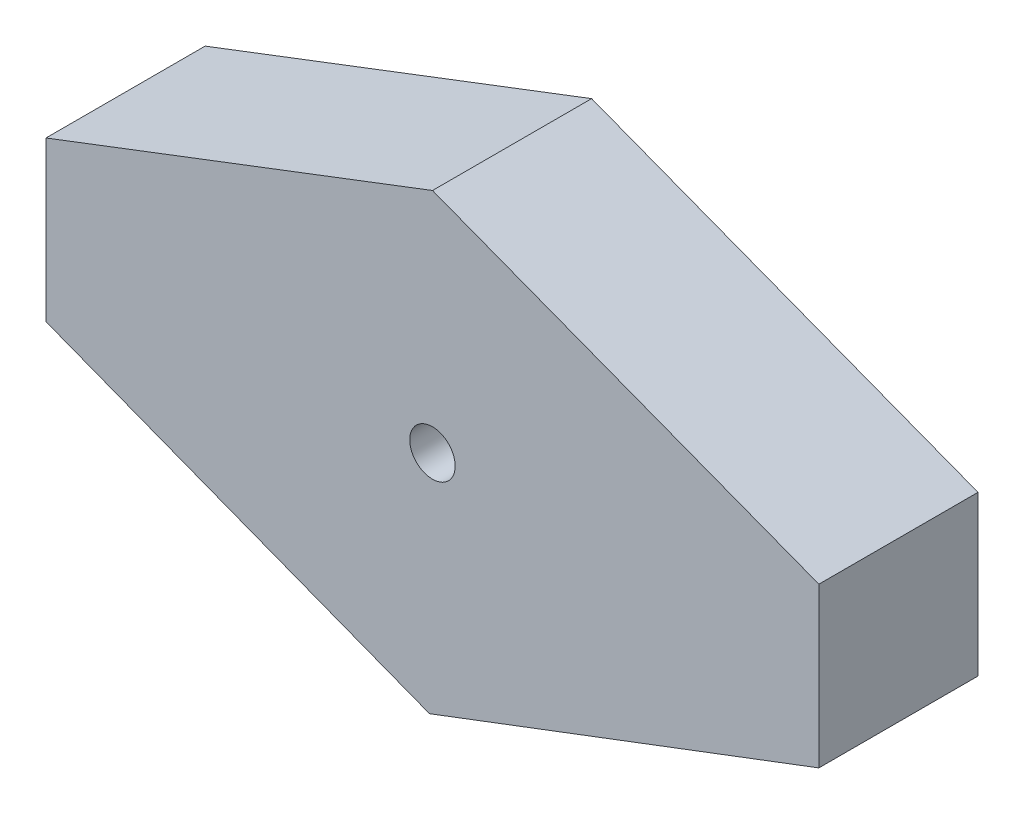
ISO-10303-21;
HEADER;
FILE_DESCRIPTION(('STEP AP214'),'2;1');
FILE_NAME('part.step','',(''),(''),'','','');
FILE_SCHEMA(('AUTOMOTIVE_DESIGN { 1 0 10303 214 1 1 1 1 }'));
ENDSEC;
DATA;
#1=APPLICATION_CONTEXT('core data for automotive mechanical design processes');
#2=APPLICATION_PROTOCOL_DEFINITION('international standard','automotive_design',2000,#1);
#3=PRODUCT_CONTEXT('',#1,'mechanical');
#4=PRODUCT('Part','Part','',(#3));
#5=PRODUCT_RELATED_PRODUCT_CATEGORY('part','',(#4));
#6=PRODUCT_DEFINITION_FORMATION('','',#4);
#7=PRODUCT_DEFINITION_CONTEXT('part definition',#1,'design');
#8=PRODUCT_DEFINITION('design','',#6,#7);
#9=PRODUCT_DEFINITION_SHAPE('','',#8);
#10=(LENGTH_UNIT() NAMED_UNIT(*) SI_UNIT(.MILLI.,.METRE.));
#11=(NAMED_UNIT(*) PLANE_ANGLE_UNIT() SI_UNIT($,.RADIAN.));
#12=(NAMED_UNIT(*) SI_UNIT($,.STERADIAN.) SOLID_ANGLE_UNIT());
#13=UNCERTAINTY_MEASURE_WITH_UNIT(LENGTH_MEASURE(1.E-05),#10,'distance_accuracy_value','');
#14=(GEOMETRIC_REPRESENTATION_CONTEXT(3) GLOBAL_UNCERTAINTY_ASSIGNED_CONTEXT((#13)) GLOBAL_UNIT_ASSIGNED_CONTEXT((#10,
#11,#12)) REPRESENTATION_CONTEXT('',''));
#15=CARTESIAN_POINT('',(0.,0.,0.));
#16=DIRECTION('',(0.,0.,1.));
#17=DIRECTION('',(1.,0.,0.));
#18=AXIS2_PLACEMENT_3D('',#15,#16,#17);
#19=CARTESIAN_POINT('',(-3.33523580590121,8.72407419084104,7.));
#20=DIRECTION('',(-0.357096400306171,0.934067535507136,0.));
#21=DIRECTION('',(-0.934067535507136,-0.357096400306171,0.));
#22=AXIS2_PLACEMENT_3D('',#19,#20,#21);
#23=PLANE('',#22);
#24=DIRECTION('',(0.934067535507136,0.357096400306171,0.));
#25=VECTOR('',#24,1.);
#26=CARTESIAN_POINT('',(-3.33523580590121,8.72407419084104,0.));
#27=LINE('',#26,#25);
#28=CARTESIAN_POINT('',(-17.,3.5,0.));
#29=VERTEX_POINT('',#28);
#30=CARTESIAN_POINT('',(0.00327850101035799,10.0003967221894,0.));
#31=VERTEX_POINT('',#30);
#32=EDGE_CURVE('E137',#29,#31,#27,.T.);
#33=ORIENTED_EDGE('',*,*,#32,.F.);
#34=DIRECTION('',(0.,0.,-1.));
#35=VECTOR('',#34,1.);
#36=CARTESIAN_POINT('',(-17.,3.5,7.));
#37=LINE('',#36,#35);
#38=CARTESIAN_POINT('',(-17.,3.5,7.));
#39=VERTEX_POINT('',#38);
#40=EDGE_CURVE('E11',#39,#29,#37,.T.);
#41=ORIENTED_EDGE('',*,*,#40,.F.);
#42=DIRECTION('',(0.934067535507136,0.357096400306171,0.));
#43=VECTOR('',#42,1.);
#44=CARTESIAN_POINT('',(-3.33523580590121,8.72407419084104,7.));
#45=LINE('',#44,#43);
#46=CARTESIAN_POINT('',(0.00327850101035799,10.0003967221894,7.));
#47=VERTEX_POINT('',#46);
#48=EDGE_CURVE('E160',#39,#47,#45,.T.);
#49=ORIENTED_EDGE('',*,*,#48,.T.);
#50=DIRECTION('',(0.,0.,-1.));
#51=VECTOR('',#50,1.);
#52=CARTESIAN_POINT('',(0.00327850101035799,10.0003967221894,7.));
#53=LINE('',#52,#51);
#54=EDGE_CURVE('E93',#47,#31,#53,.T.);
#55=ORIENTED_EDGE('',*,*,#54,.T.);
#56=EDGE_LOOP('',(#33,#41,#49,#55));
#57=FACE_BOUND('',#56,.T.);
#58=ADVANCED_FACE('F47',(#57),#23,.T.);
#59=CARTESIAN_POINT('',(-17.,0.,7.));
#60=DIRECTION('',(-1.,0.,0.));
#61=DIRECTION('',(0.,0.,1.));
#62=AXIS2_PLACEMENT_3D('',#59,#60,#61);
#63=PLANE('',#62);
#64=DIRECTION('',(0.,1.,0.));
#65=VECTOR('',#64,1.);
#66=CARTESIAN_POINT('',(-17.,0.,0.));
#67=LINE('',#66,#65);
#68=CARTESIAN_POINT('',(-17.,-3.5,0.));
#69=VERTEX_POINT('',#68);
#70=EDGE_CURVE('E141',#69,#29,#67,.T.);
#71=ORIENTED_EDGE('',*,*,#70,.F.);
#72=DIRECTION('',(0.,0.,-1.));
#73=VECTOR('',#72,1.);
#74=CARTESIAN_POINT('',(-17.,-3.5,7.));
#75=LINE('',#74,#73);
#76=CARTESIAN_POINT('',(-17.,-3.5,7.));
#77=VERTEX_POINT('',#76);
#78=EDGE_CURVE('E56',#77,#69,#75,.T.);
#79=ORIENTED_EDGE('',*,*,#78,.F.);
#80=DIRECTION('',(0.,1.,0.));
#81=VECTOR('',#80,1.);
#82=CARTESIAN_POINT('',(-17.,0.,7.));
#83=LINE('',#82,#81);
#84=EDGE_CURVE('E181',#77,#39,#83,.T.);
#85=ORIENTED_EDGE('',*,*,#84,.T.);
#86=ORIENTED_EDGE('',*,*,#40,.T.);
#87=EDGE_LOOP('',(#71,#79,#85,#86));
#88=FACE_BOUND('',#87,.T.);
#89=ADVANCED_FACE('F173',(#88),#63,.T.);
#90=CARTESIAN_POINT('',(-3.37094844904208,-8.75038071733361,7.));
#91=DIRECTION('',(-0.359482297756313,-0.933151904890003,0.));
#92=DIRECTION('',(0.933151904890003,-0.359482297756313,0.));
#93=AXIS2_PLACEMENT_3D('',#90,#91,#92);
#94=PLANE('',#93);
#95=DIRECTION('',(-0.933151904890003,0.359482297756313,0.));
#96=VECTOR('',#95,1.);
#97=CARTESIAN_POINT('',(-3.37094844904208,-8.75038071733361,0.));
#98=LINE('',#97,#96);
#99=CARTESIAN_POINT('',(-0.12933078779632,-9.9991636423917,0.));
#100=VERTEX_POINT('',#99);
#101=EDGE_CURVE('E145',#100,#69,#98,.T.);
#102=ORIENTED_EDGE('',*,*,#101,.F.);
#103=DIRECTION('',(0.,0.,-1.));
#104=VECTOR('',#103,1.);
#105=CARTESIAN_POINT('',(-0.12933078779632,-9.9991636423917,7.));
#106=LINE('',#105,#104);
#107=CARTESIAN_POINT('',(-0.12933078779632,-9.9991636423917,7.));
#108=VERTEX_POINT('',#107);
#109=EDGE_CURVE('E123',#108,#100,#106,.T.);
#110=ORIENTED_EDGE('',*,*,#109,.F.);
#111=DIRECTION('',(-0.933151904890003,0.359482297756313,0.));
#112=VECTOR('',#111,1.);
#113=CARTESIAN_POINT('',(-3.37094844904208,-8.75038071733361,7.));
#114=LINE('',#113,#112);
#115=EDGE_CURVE('E114',#108,#77,#114,.T.);
#116=ORIENTED_EDGE('',*,*,#115,.T.);
#117=ORIENTED_EDGE('',*,*,#78,.T.);
#118=EDGE_LOOP('',(#102,#110,#116,#117));
#119=FACE_BOUND('',#118,.T.);
#120=ADVANCED_FACE('F170',(#119),#94,.T.);
#121=CARTESIAN_POINT('',(3.30015514878063,-8.69795750730007,7.));
#122=DIRECTION('',(-0.3547416159971,0.934964376797194,0.));
#123=DIRECTION('',(-0.934964376797194,-0.3547416159971,0.));
#124=AXIS2_PLACEMENT_3D('',#121,#122,#123);
#125=PLANE('',#124);
#126=DIRECTION('',(0.934964376797194,0.3547416159971,0.));
#127=VECTOR('',#126,1.);
#128=CARTESIAN_POINT('',(3.30015514878063,-8.69795750730007,0.));
#129=LINE('',#128,#127);
#130=CARTESIAN_POINT('',(17.,-3.5,0.));
#131=VERTEX_POINT('',#130);
#132=EDGE_CURVE('E121',#100,#131,#129,.T.);
#133=ORIENTED_EDGE('',*,*,#132,.T.);
#134=DIRECTION('',(0.,0.,-1.));
#135=VECTOR('',#134,1.);
#136=CARTESIAN_POINT('',(17.,-3.5,7.));
#137=LINE('',#136,#135);
#138=CARTESIAN_POINT('',(17.,-3.5,7.));
#139=VERTEX_POINT('',#138);
#140=EDGE_CURVE('E118',#139,#131,#137,.T.);
#141=ORIENTED_EDGE('',*,*,#140,.F.);
#142=DIRECTION('',(0.934964376797194,0.3547416159971,0.));
#143=VECTOR('',#142,1.);
#144=CARTESIAN_POINT('',(3.30015514878063,-8.69795750730007,7.));
#145=LINE('',#144,#143);
#146=EDGE_CURVE('E106',#108,#139,#145,.T.);
#147=ORIENTED_EDGE('',*,*,#146,.F.);
#148=ORIENTED_EDGE('',*,*,#109,.T.);
#149=EDGE_LOOP('',(#133,#141,#147,#148));
#150=FACE_BOUND('',#149,.T.);
#151=ADVANCED_FACE('F119',(#150),#125,.F.);
#152=CARTESIAN_POINT('',(17.,0.,7.));
#153=DIRECTION('',(-1.,0.,0.));
#154=DIRECTION('',(0.,0.,1.));
#155=AXIS2_PLACEMENT_3D('',#152,#153,#154);
#156=PLANE('',#155);
#157=DIRECTION('',(0.,1.,0.));
#158=VECTOR('',#157,1.);
#159=CARTESIAN_POINT('',(17.,0.,0.));
#160=LINE('',#159,#158);
#161=CARTESIAN_POINT('',(17.,3.5,0.));
#162=VERTEX_POINT('',#161);
#163=EDGE_CURVE('E86',#131,#162,#160,.T.);
#164=ORIENTED_EDGE('',*,*,#163,.T.);
#165=DIRECTION('',(0.,0.,-1.));
#166=VECTOR('',#165,1.);
#167=CARTESIAN_POINT('',(17.,3.5,7.));
#168=LINE('',#167,#166);
#169=CARTESIAN_POINT('',(17.,3.5,7.));
#170=VERTEX_POINT('',#169);
#171=EDGE_CURVE('E124',#170,#162,#168,.T.);
#172=ORIENTED_EDGE('',*,*,#171,.F.);
#173=DIRECTION('',(0.,1.,0.));
#174=VECTOR('',#173,1.);
#175=CARTESIAN_POINT('',(17.,0.,7.));
#176=LINE('',#175,#174);
#177=EDGE_CURVE('E111',#139,#170,#176,.T.);
#178=ORIENTED_EDGE('',*,*,#177,.F.);
#179=ORIENTED_EDGE('',*,*,#140,.T.);
#180=EDGE_LOOP('',(#164,#172,#178,#179));
#181=FACE_BOUND('',#180,.T.);
#182=ADVANCED_FACE('F126',(#181),#156,.F.);
#183=CARTESIAN_POINT('',(3.33703070681589,8.72540307635608,7.));
#184=DIRECTION('',(-0.357216585270214,-0.93402157962645,0.));
#185=DIRECTION('',(0.93402157962645,-0.357216585270214,0.));
#186=AXIS2_PLACEMENT_3D('',#183,#184,#185);
#187=PLANE('',#186);
#188=DIRECTION('',(-0.934021579626449,0.357216585270214,0.));
#189=VECTOR('',#188,1.);
#190=CARTESIAN_POINT('',(3.33703070681589,8.72540307635608,0.));
#191=LINE('',#190,#189);
#192=EDGE_CURVE('E153',#162,#31,#191,.T.);
#193=ORIENTED_EDGE('',*,*,#192,.T.);
#194=ORIENTED_EDGE('',*,*,#54,.F.);
#195=DIRECTION('',(-0.934021579626449,0.357216585270214,0.));
#196=VECTOR('',#195,1.);
#197=CARTESIAN_POINT('',(3.33703070681589,8.72540307635608,7.));
#198=LINE('',#197,#196);
#199=EDGE_CURVE('E64',#170,#47,#198,.T.);
#200=ORIENTED_EDGE('',*,*,#199,.F.);
#201=ORIENTED_EDGE('',*,*,#171,.T.);
#202=EDGE_LOOP('',(#193,#194,#200,#201));
#203=FACE_BOUND('',#202,.T.);
#204=ADVANCED_FACE('F179',(#203),#187,.F.);
#205=CARTESIAN_POINT('',(0.,0.,7.));
#206=DIRECTION('',(0.,0.,-1.));
#207=DIRECTION('',(-1.,0.,0.));
#208=AXIS2_PLACEMENT_3D('',#205,#206,#207);
#209=CYLINDRICAL_SURFACE('',#208,1.);
#210=CARTESIAN_POINT('',(0.,0.,7.));
#211=DIRECTION('',(0.,0.,1.));
#212=DIRECTION('',(1.,0.,0.));
#213=AXIS2_PLACEMENT_3D('',#210,#211,#212);
#214=CIRCLE('',#213,1.);
#215=CARTESIAN_POINT('',(1.,0.,7.));
#216=VERTEX_POINT('',#215);
#217=EDGE_CURVE('E130',#216,#216,#214,.T.);
#218=ORIENTED_EDGE('',*,*,#217,.T.);
#219=EDGE_LOOP('',(#218));
#220=FACE_BOUND('',#219,.T.);
#221=CARTESIAN_POINT('',(0.,0.,0.));
#222=DIRECTION('',(0.,0.,1.));
#223=DIRECTION('',(1.,0.,0.));
#224=AXIS2_PLACEMENT_3D('',#221,#222,#223);
#225=CIRCLE('',#224,1.);
#226=CARTESIAN_POINT('',(1.,0.,0.));
#227=VERTEX_POINT('',#226);
#228=EDGE_CURVE('E156',#227,#227,#225,.T.);
#229=ORIENTED_EDGE('',*,*,#228,.F.);
#230=EDGE_LOOP('',(#229));
#231=FACE_BOUND('',#230,.T.);
#232=ADVANCED_FACE('F201',(#220,#231),#209,.F.);
#233=CARTESIAN_POINT('',(0.,0.,7.));
#234=DIRECTION('',(0.,0.,1.));
#235=DIRECTION('',(1.,0.,0.));
#236=AXIS2_PLACEMENT_3D('',#233,#234,#235);
#237=PLANE('',#236);
#238=ORIENTED_EDGE('',*,*,#48,.F.);
#239=ORIENTED_EDGE('',*,*,#84,.F.);
#240=ORIENTED_EDGE('',*,*,#115,.F.);
#241=ORIENTED_EDGE('',*,*,#146,.T.);
#242=ORIENTED_EDGE('',*,*,#177,.T.);
#243=ORIENTED_EDGE('',*,*,#199,.T.);
#244=EDGE_LOOP('',(#238,#239,#240,#241,#242,#243));
#245=FACE_BOUND('',#244,.T.);
#246=ORIENTED_EDGE('',*,*,#217,.F.);
#247=EDGE_LOOP('',(#246));
#248=FACE_BOUND('',#247,.T.);
#249=ADVANCED_FACE('F108',(#245,#248),#237,.T.);
#250=CARTESIAN_POINT('',(0.,0.,0.));
#251=DIRECTION('',(0.,0.,1.));
#252=DIRECTION('',(1.,0.,0.));
#253=AXIS2_PLACEMENT_3D('',#250,#251,#252);
#254=PLANE('',#253);
#255=ORIENTED_EDGE('',*,*,#32,.T.);
#256=ORIENTED_EDGE('',*,*,#192,.F.);
#257=ORIENTED_EDGE('',*,*,#163,.F.);
#258=ORIENTED_EDGE('',*,*,#132,.F.);
#259=ORIENTED_EDGE('',*,*,#101,.T.);
#260=ORIENTED_EDGE('',*,*,#70,.T.);
#261=EDGE_LOOP('',(#255,#256,#257,#258,#259,#260));
#262=FACE_BOUND('',#261,.T.);
#263=ORIENTED_EDGE('',*,*,#228,.T.);
#264=EDGE_LOOP('',(#263));
#265=FACE_BOUND('',#264,.T.);
#266=ADVANCED_FACE('F175',(#262,#265),#254,.F.);
#267=CLOSED_SHELL('',(#58,#89,#120,#151,#182,#204,#232,#249,#266));
#268=MANIFOLD_SOLID_BREP('B2',#267);
#269=ADVANCED_BREP_SHAPE_REPRESENTATION('',(#18,#268),#14);
#270=SHAPE_DEFINITION_REPRESENTATION(#9,#269);
ENDSEC;
END-ISO-10303-21;
